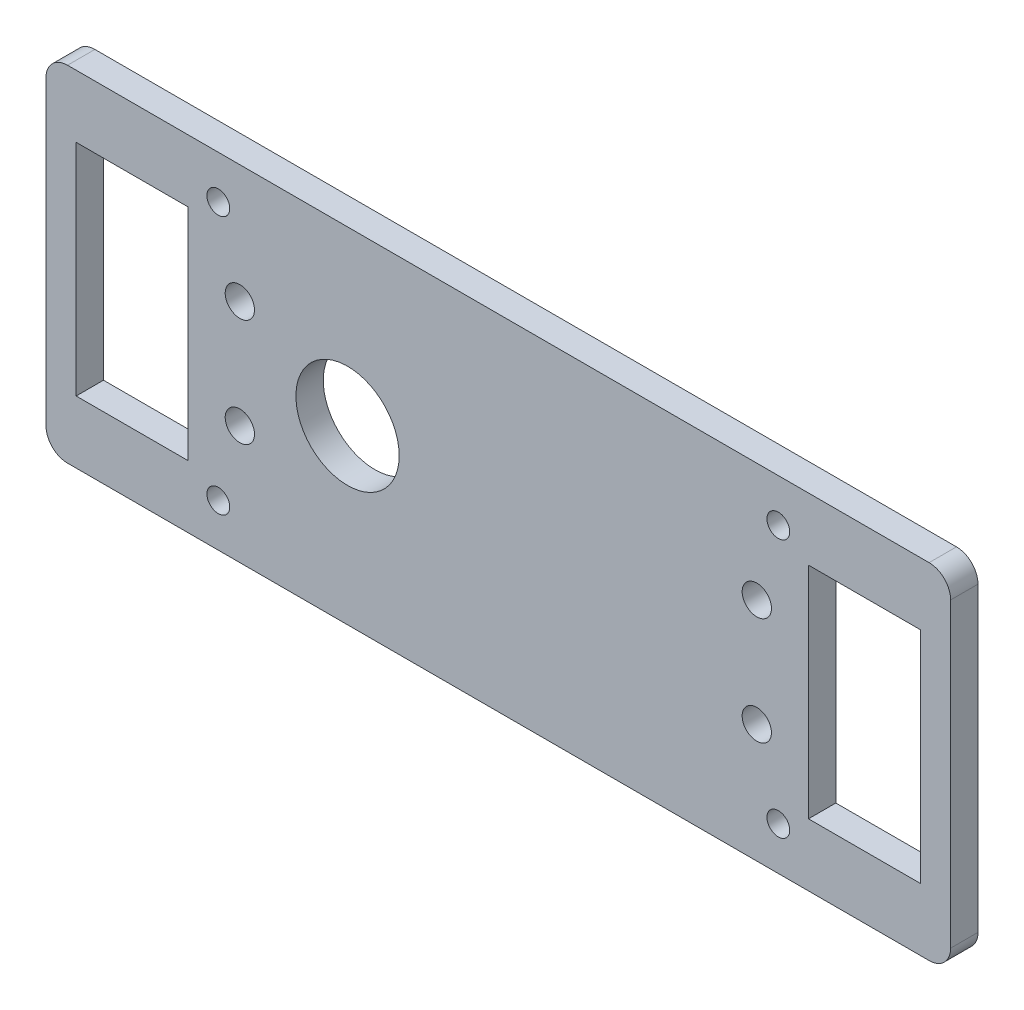
ISO-10303-21;
HEADER;
FILE_DESCRIPTION(('STEP AP214'),'2;1');
FILE_NAME('part.step','',(''),(''),'','','');
FILE_SCHEMA(('AUTOMOTIVE_DESIGN { 1 0 10303 214 1 1 1 1 }'));
ENDSEC;
DATA;
#1=APPLICATION_CONTEXT('core data for automotive mechanical design processes');
#2=APPLICATION_PROTOCOL_DEFINITION('international standard','automotive_design',2000,#1);
#3=PRODUCT_CONTEXT('',#1,'mechanical');
#4=PRODUCT('Part','Part','',(#3));
#5=PRODUCT_RELATED_PRODUCT_CATEGORY('part','',(#4));
#6=PRODUCT_DEFINITION_FORMATION('','',#4);
#7=PRODUCT_DEFINITION_CONTEXT('part definition',#1,'design');
#8=PRODUCT_DEFINITION('design','',#6,#7);
#9=PRODUCT_DEFINITION_SHAPE('','',#8);
#10=(LENGTH_UNIT() NAMED_UNIT(*) SI_UNIT(.MILLI.,.METRE.));
#11=(NAMED_UNIT(*) PLANE_ANGLE_UNIT() SI_UNIT($,.RADIAN.));
#12=(NAMED_UNIT(*) SI_UNIT($,.STERADIAN.) SOLID_ANGLE_UNIT());
#13=UNCERTAINTY_MEASURE_WITH_UNIT(LENGTH_MEASURE(1.E-05),#10,'distance_accuracy_value','');
#14=(GEOMETRIC_REPRESENTATION_CONTEXT(3) GLOBAL_UNCERTAINTY_ASSIGNED_CONTEXT((#13)) GLOBAL_UNIT_ASSIGNED_CONTEXT((#10,
#11,#12)) REPRESENTATION_CONTEXT('',''));
#15=CARTESIAN_POINT('',(0.,0.,0.));
#16=DIRECTION('',(0.,0.,1.));
#17=DIRECTION('',(1.,0.,0.));
#18=AXIS2_PLACEMENT_3D('',#15,#16,#17);
#19=CARTESIAN_POINT('',(-70.,40.,-6.35));
#20=DIRECTION('',(-1.,0.,0.));
#21=DIRECTION('',(0.,0.,1.));
#22=AXIS2_PLACEMENT_3D('',#19,#20,#21);
#23=PLANE('',#22);
#24=DIRECTION('',(0.,-1.,0.));
#25=VECTOR('',#24,1.);
#26=CARTESIAN_POINT('',(-70.,40.,-6.35));
#27=LINE('',#26,#25);
#28=CARTESIAN_POINT('',(-70.,35.,-6.35));
#29=VERTEX_POINT('',#28);
#30=CARTESIAN_POINT('',(-70.,-35.,-6.35));
#31=VERTEX_POINT('',#30);
#32=EDGE_CURVE('E266',#29,#31,#27,.T.);
#33=ORIENTED_EDGE('',*,*,#32,.T.);
#34=DIRECTION('',(0.,0.,1.));
#35=VECTOR('',#34,1.);
#36=CARTESIAN_POINT('',(-70.,-35.,-6.35));
#37=LINE('',#36,#35);
#38=CARTESIAN_POINT('',(-70.,-35.,0.));
#39=VERTEX_POINT('',#38);
#40=EDGE_CURVE('E11',#31,#39,#37,.T.);
#41=ORIENTED_EDGE('',*,*,#40,.T.);
#42=DIRECTION('',(0.,-1.,0.));
#43=VECTOR('',#42,1.);
#44=CARTESIAN_POINT('',(-70.,40.,0.));
#45=LINE('',#44,#43);
#46=CARTESIAN_POINT('',(-70.,35.,0.));
#47=VERTEX_POINT('',#46);
#48=EDGE_CURVE('E262',#47,#39,#45,.T.);
#49=ORIENTED_EDGE('',*,*,#48,.F.);
#50=DIRECTION('',(0.,0.,1.));
#51=VECTOR('',#50,1.);
#52=CARTESIAN_POINT('',(-70.,35.,-6.35));
#53=LINE('',#52,#51);
#54=EDGE_CURVE('E48',#47,#29,#53,.F.);
#55=ORIENTED_EDGE('',*,*,#54,.T.);
#56=EDGE_LOOP('',(#33,#41,#49,#55));
#57=FACE_BOUND('',#56,.T.);
#58=ADVANCED_FACE('F39',(#57),#23,.T.);
#59=CARTESIAN_POINT('',(-70.,40.,-6.35));
#60=DIRECTION('',(0.,1.,0.));
#61=DIRECTION('',(0.,0.,1.));
#62=AXIS2_PLACEMENT_3D('',#59,#60,#61);
#63=PLANE('',#62);
#64=DIRECTION('',(-1.,0.,0.));
#65=VECTOR('',#64,1.);
#66=CARTESIAN_POINT('',(-70.,40.,0.));
#67=LINE('',#66,#65);
#68=CARTESIAN_POINT('',(135.,40.,0.));
#69=VERTEX_POINT('',#68);
#70=CARTESIAN_POINT('',(-65.,40.,0.));
#71=VERTEX_POINT('',#70);
#72=EDGE_CURVE('E271',#69,#71,#67,.T.);
#73=ORIENTED_EDGE('',*,*,#72,.F.);
#74=DIRECTION('',(0.,0.,1.));
#75=VECTOR('',#74,1.);
#76=CARTESIAN_POINT('',(135.,40.,-6.35));
#77=LINE('',#76,#75);
#78=CARTESIAN_POINT('',(135.,40.,-6.35));
#79=VERTEX_POINT('',#78);
#80=EDGE_CURVE('E62',#69,#79,#77,.F.);
#81=ORIENTED_EDGE('',*,*,#80,.T.);
#82=DIRECTION('',(-1.,0.,0.));
#83=VECTOR('',#82,1.);
#84=CARTESIAN_POINT('',(-70.,40.,-6.35));
#85=LINE('',#84,#83);
#86=CARTESIAN_POINT('',(-65.,40.,-6.35));
#87=VERTEX_POINT('',#86);
#88=EDGE_CURVE('E279',#79,#87,#85,.T.);
#89=ORIENTED_EDGE('',*,*,#88,.T.);
#90=DIRECTION('',(0.,0.,1.));
#91=VECTOR('',#90,1.);
#92=CARTESIAN_POINT('',(-65.,40.,-6.35));
#93=LINE('',#92,#91);
#94=EDGE_CURVE('E333',#87,#71,#93,.T.);
#95=ORIENTED_EDGE('',*,*,#94,.T.);
#96=EDGE_LOOP('',(#73,#81,#89,#95));
#97=FACE_BOUND('',#96,.T.);
#98=ADVANCED_FACE('F348',(#97),#63,.T.);
#99=CARTESIAN_POINT('',(140.,40.,-6.35));
#100=DIRECTION('',(1.,0.,0.));
#101=DIRECTION('',(0.,0.,-1.));
#102=AXIS2_PLACEMENT_3D('',#99,#100,#101);
#103=PLANE('',#102);
#104=DIRECTION('',(0.,1.,0.));
#105=VECTOR('',#104,1.);
#106=CARTESIAN_POINT('',(140.,40.,0.));
#107=LINE('',#106,#105);
#108=CARTESIAN_POINT('',(140.,-35.,0.));
#109=VERTEX_POINT('',#108);
#110=CARTESIAN_POINT('',(140.,35.,0.));
#111=VERTEX_POINT('',#110);
#112=EDGE_CURVE('E290',#109,#111,#107,.T.);
#113=ORIENTED_EDGE('',*,*,#112,.F.);
#114=DIRECTION('',(0.,0.,1.));
#115=VECTOR('',#114,1.);
#116=CARTESIAN_POINT('',(140.,-35.,-6.35));
#117=LINE('',#116,#115);
#118=CARTESIAN_POINT('',(140.,-35.,-6.35));
#119=VERTEX_POINT('',#118);
#120=EDGE_CURVE('E319',#109,#119,#117,.F.);
#121=ORIENTED_EDGE('',*,*,#120,.T.);
#122=DIRECTION('',(0.,1.,0.));
#123=VECTOR('',#122,1.);
#124=CARTESIAN_POINT('',(140.,40.,-6.35));
#125=LINE('',#124,#123);
#126=CARTESIAN_POINT('',(140.,35.,-6.35));
#127=VERTEX_POINT('',#126);
#128=EDGE_CURVE('E275',#119,#127,#125,.T.);
#129=ORIENTED_EDGE('',*,*,#128,.T.);
#130=DIRECTION('',(0.,0.,1.));
#131=VECTOR('',#130,1.);
#132=CARTESIAN_POINT('',(140.,35.,-6.35));
#133=LINE('',#132,#131);
#134=EDGE_CURVE('E315',#127,#111,#133,.T.);
#135=ORIENTED_EDGE('',*,*,#134,.T.);
#136=EDGE_LOOP('',(#113,#121,#129,#135));
#137=FACE_BOUND('',#136,.T.);
#138=ADVANCED_FACE('F357',(#137),#103,.T.);
#139=CARTESIAN_POINT('',(-70.,-40.,-6.35));
#140=DIRECTION('',(0.,-1.,0.));
#141=DIRECTION('',(0.,0.,-1.));
#142=AXIS2_PLACEMENT_3D('',#139,#140,#141);
#143=PLANE('',#142);
#144=DIRECTION('',(1.,0.,0.));
#145=VECTOR('',#144,1.);
#146=CARTESIAN_POINT('',(-70.,-40.,-6.35));
#147=LINE('',#146,#145);
#148=CARTESIAN_POINT('',(-65.,-40.,-6.35));
#149=VERTEX_POINT('',#148);
#150=CARTESIAN_POINT('',(135.,-40.,-6.35));
#151=VERTEX_POINT('',#150);
#152=EDGE_CURVE('E270',#149,#151,#147,.T.);
#153=ORIENTED_EDGE('',*,*,#152,.T.);
#154=DIRECTION('',(0.,0.,1.));
#155=VECTOR('',#154,1.);
#156=CARTESIAN_POINT('',(135.,-40.,-6.35));
#157=LINE('',#156,#155);
#158=CARTESIAN_POINT('',(135.,-40.,0.));
#159=VERTEX_POINT('',#158);
#160=EDGE_CURVE('E299',#151,#159,#157,.T.);
#161=ORIENTED_EDGE('',*,*,#160,.T.);
#162=DIRECTION('',(1.,0.,0.));
#163=VECTOR('',#162,1.);
#164=CARTESIAN_POINT('',(-70.,-40.,0.));
#165=LINE('',#164,#163);
#166=CARTESIAN_POINT('',(-65.,-40.,0.));
#167=VERTEX_POINT('',#166);
#168=EDGE_CURVE('E286',#167,#159,#165,.T.);
#169=ORIENTED_EDGE('',*,*,#168,.F.);
#170=DIRECTION('',(0.,0.,1.));
#171=VECTOR('',#170,1.);
#172=CARTESIAN_POINT('',(-65.,-40.,-6.35));
#173=LINE('',#172,#171);
#174=EDGE_CURVE('E282',#167,#149,#173,.F.);
#175=ORIENTED_EDGE('',*,*,#174,.T.);
#176=EDGE_LOOP('',(#153,#161,#169,#175));
#177=FACE_BOUND('',#176,.T.);
#178=ADVANCED_FACE('F365',(#177),#143,.T.);
#179=CARTESIAN_POINT('',(0.,0.,-6.35));
#180=DIRECTION('',(0.,0.,1.));
#181=DIRECTION('',(1.,0.,0.));
#182=AXIS2_PLACEMENT_3D('',#179,#180,#181);
#183=PLANE('',#182);
#184=CARTESIAN_POINT('',(-25.,12.5,-6.35));
#185=DIRECTION('',(0.,0.,1.));
#186=DIRECTION('',(1.,0.,0.));
#187=AXIS2_PLACEMENT_3D('',#184,#185,#186);
#188=CIRCLE('',#187,3.4);
#189=CARTESIAN_POINT('',(-21.6,12.5,-6.35));
#190=VERTEX_POINT('',#189);
#191=EDGE_CURVE('E619',#190,#190,#188,.T.);
#192=ORIENTED_EDGE('',*,*,#191,.T.);
#193=EDGE_LOOP('',(#192));
#194=FACE_BOUND('',#193,.T.);
#195=CARTESIAN_POINT('',(-25.,-12.5,-6.35));
#196=DIRECTION('',(0.,0.,1.));
#197=DIRECTION('',(1.,0.,0.));
#198=AXIS2_PLACEMENT_3D('',#195,#196,#197);
#199=CIRCLE('',#198,3.4);
#200=CARTESIAN_POINT('',(-21.6,-12.5,-6.35));
#201=VERTEX_POINT('',#200);
#202=EDGE_CURVE('E632',#201,#201,#199,.T.);
#203=ORIENTED_EDGE('',*,*,#202,.T.);
#204=EDGE_LOOP('',(#203));
#205=FACE_BOUND('',#204,.T.);
#206=CARTESIAN_POINT('',(95.,12.5,-6.35));
#207=DIRECTION('',(0.,0.,1.));
#208=DIRECTION('',(1.,0.,0.));
#209=AXIS2_PLACEMENT_3D('',#206,#207,#208);
#210=CIRCLE('',#209,3.4);
#211=CARTESIAN_POINT('',(98.4,12.5,-6.35));
#212=VERTEX_POINT('',#211);
#213=EDGE_CURVE('E640',#212,#212,#210,.T.);
#214=ORIENTED_EDGE('',*,*,#213,.T.);
#215=EDGE_LOOP('',(#214));
#216=FACE_BOUND('',#215,.T.);
#217=CARTESIAN_POINT('',(95.,-12.5,-6.35));
#218=DIRECTION('',(0.,0.,1.));
#219=DIRECTION('',(1.,0.,0.));
#220=AXIS2_PLACEMENT_3D('',#217,#218,#219);
#221=CIRCLE('',#220,3.4);
#222=CARTESIAN_POINT('',(98.4,-12.5,-6.35));
#223=VERTEX_POINT('',#222);
#224=EDGE_CURVE('E648',#223,#223,#221,.T.);
#225=ORIENTED_EDGE('',*,*,#224,.T.);
#226=EDGE_LOOP('',(#225));
#227=FACE_BOUND('',#226,.T.);
#228=CARTESIAN_POINT('',(-30.,30.,-6.35));
#229=DIRECTION('',(0.,0.,1.));
#230=DIRECTION('',(1.,0.,0.));
#231=AXIS2_PLACEMENT_3D('',#228,#229,#230);
#232=CIRCLE('',#231,2.65);
#233=CARTESIAN_POINT('',(-27.35,30.,-6.35));
#234=VERTEX_POINT('',#233);
#235=EDGE_CURVE('E656',#234,#234,#232,.T.);
#236=ORIENTED_EDGE('',*,*,#235,.T.);
#237=EDGE_LOOP('',(#236));
#238=FACE_BOUND('',#237,.T.);
#239=CARTESIAN_POINT('',(-30.,-30.,-6.35));
#240=DIRECTION('',(0.,0.,1.));
#241=DIRECTION('',(1.,0.,0.));
#242=AXIS2_PLACEMENT_3D('',#239,#240,#241);
#243=CIRCLE('',#242,2.65);
#244=CARTESIAN_POINT('',(-27.35,-30.,-6.35));
#245=VERTEX_POINT('',#244);
#246=EDGE_CURVE('E664',#245,#245,#243,.T.);
#247=ORIENTED_EDGE('',*,*,#246,.T.);
#248=EDGE_LOOP('',(#247));
#249=FACE_BOUND('',#248,.T.);
#250=CARTESIAN_POINT('',(100.,-30.,-6.35));
#251=DIRECTION('',(0.,0.,1.));
#252=DIRECTION('',(1.,0.,0.));
#253=AXIS2_PLACEMENT_3D('',#250,#251,#252);
#254=CIRCLE('',#253,2.65);
#255=CARTESIAN_POINT('',(102.65,-30.,-6.35));
#256=VERTEX_POINT('',#255);
#257=EDGE_CURVE('E672',#256,#256,#254,.T.);
#258=ORIENTED_EDGE('',*,*,#257,.T.);
#259=EDGE_LOOP('',(#258));
#260=FACE_BOUND('',#259,.T.);
#261=CARTESIAN_POINT('',(100.,30.,-6.35));
#262=DIRECTION('',(0.,0.,1.));
#263=DIRECTION('',(1.,0.,0.));
#264=AXIS2_PLACEMENT_3D('',#261,#262,#263);
#265=CIRCLE('',#264,2.65);
#266=CARTESIAN_POINT('',(102.65,30.,-6.35));
#267=VERTEX_POINT('',#266);
#268=EDGE_CURVE('E190',#267,#267,#265,.T.);
#269=ORIENTED_EDGE('',*,*,#268,.T.);
#270=EDGE_LOOP('',(#269));
#271=FACE_BOUND('',#270,.T.);
#272=DIRECTION('',(-1.,0.,0.));
#273=VECTOR('',#272,1.);
#274=CARTESIAN_POINT('',(107.,25.5,-6.35));
#275=LINE('',#274,#273);
#276=CARTESIAN_POINT('',(133.,25.5,-6.35));
#277=VERTEX_POINT('',#276);
#278=CARTESIAN_POINT('',(107.,25.5,-6.35));
#279=VERTEX_POINT('',#278);
#280=EDGE_CURVE('E168',#277,#279,#275,.T.);
#281=ORIENTED_EDGE('',*,*,#280,.T.);
#282=DIRECTION('',(0.,-1.,0.));
#283=VECTOR('',#282,1.);
#284=CARTESIAN_POINT('',(107.,25.5,-6.35));
#285=LINE('',#284,#283);
#286=CARTESIAN_POINT('',(107.,-25.5,-6.35));
#287=VERTEX_POINT('',#286);
#288=EDGE_CURVE('E159',#279,#287,#285,.T.);
#289=ORIENTED_EDGE('',*,*,#288,.T.);
#290=DIRECTION('',(1.,0.,0.));
#291=VECTOR('',#290,1.);
#292=CARTESIAN_POINT('',(107.,-25.5,-6.35));
#293=LINE('',#292,#291);
#294=CARTESIAN_POINT('',(133.,-25.5,-6.35));
#295=VERTEX_POINT('',#294);
#296=EDGE_CURVE('E172',#287,#295,#293,.T.);
#297=ORIENTED_EDGE('',*,*,#296,.T.);
#298=DIRECTION('',(0.,1.,0.));
#299=VECTOR('',#298,1.);
#300=CARTESIAN_POINT('',(133.,25.5,-6.35));
#301=LINE('',#300,#299);
#302=EDGE_CURVE('E177',#295,#277,#301,.T.);
#303=ORIENTED_EDGE('',*,*,#302,.T.);
#304=EDGE_LOOP('',(#281,#289,#297,#303));
#305=FACE_BOUND('',#304,.T.);
#306=DIRECTION('',(-1.,0.,0.));
#307=VECTOR('',#306,1.);
#308=CARTESIAN_POINT('',(-63.,25.5,-6.35));
#309=LINE('',#308,#307);
#310=CARTESIAN_POINT('',(-37.,25.5,-6.35));
#311=VERTEX_POINT('',#310);
#312=CARTESIAN_POINT('',(-63.,25.5,-6.35));
#313=VERTEX_POINT('',#312);
#314=EDGE_CURVE('E227',#311,#313,#309,.T.);
#315=ORIENTED_EDGE('',*,*,#314,.T.);
#316=DIRECTION('',(0.,-1.,0.));
#317=VECTOR('',#316,1.);
#318=CARTESIAN_POINT('',(-63.,25.5,-6.35));
#319=LINE('',#318,#317);
#320=CARTESIAN_POINT('',(-63.,-25.5,-6.35));
#321=VERTEX_POINT('',#320);
#322=EDGE_CURVE('E214',#313,#321,#319,.T.);
#323=ORIENTED_EDGE('',*,*,#322,.T.);
#324=DIRECTION('',(1.,0.,0.));
#325=VECTOR('',#324,1.);
#326=CARTESIAN_POINT('',(-63.,-25.5,-6.35));
#327=LINE('',#326,#325);
#328=CARTESIAN_POINT('',(-37.,-25.5,-6.35));
#329=VERTEX_POINT('',#328);
#330=EDGE_CURVE('E218',#321,#329,#327,.T.);
#331=ORIENTED_EDGE('',*,*,#330,.T.);
#332=DIRECTION('',(0.,1.,0.));
#333=VECTOR('',#332,1.);
#334=CARTESIAN_POINT('',(-37.,25.5,-6.35));
#335=LINE('',#334,#333);
#336=EDGE_CURVE('E223',#329,#311,#335,.T.);
#337=ORIENTED_EDGE('',*,*,#336,.T.);
#338=EDGE_LOOP('',(#315,#323,#331,#337));
#339=FACE_BOUND('',#338,.T.);
#340=CARTESIAN_POINT('',(0.,0.,-6.35));
#341=DIRECTION('',(0.,0.,1.));
#342=DIRECTION('',(1.,0.,0.));
#343=AXIS2_PLACEMENT_3D('',#340,#341,#342);
#344=CIRCLE('',#343,11.9875);
#345=CARTESIAN_POINT('',(11.9875,0.,-6.35));
#346=VERTEX_POINT('',#345);
#347=EDGE_CURVE('E258',#346,#346,#344,.T.);
#348=ORIENTED_EDGE('',*,*,#347,.T.);
#349=EDGE_LOOP('',(#348));
#350=FACE_BOUND('',#349,.T.);
#351=ORIENTED_EDGE('',*,*,#128,.F.);
#352=CARTESIAN_POINT('',(135.,-35.,-6.35));
#353=DIRECTION('',(0.,0.,1.));
#354=DIRECTION('',(1.,0.,0.));
#355=AXIS2_PLACEMENT_3D('',#352,#353,#354);
#356=CIRCLE('',#355,5.);
#357=EDGE_CURVE('E330',#119,#151,#356,.F.);
#358=ORIENTED_EDGE('',*,*,#357,.T.);
#359=ORIENTED_EDGE('',*,*,#152,.F.);
#360=CARTESIAN_POINT('',(-65.,-35.,-6.35));
#361=DIRECTION('',(0.,0.,1.));
#362=DIRECTION('',(1.,0.,0.));
#363=AXIS2_PLACEMENT_3D('',#360,#361,#362);
#364=CIRCLE('',#363,5.);
#365=EDGE_CURVE('E324',#149,#31,#364,.F.);
#366=ORIENTED_EDGE('',*,*,#365,.T.);
#367=ORIENTED_EDGE('',*,*,#32,.F.);
#368=CARTESIAN_POINT('',(-65.,35.,-6.35));
#369=DIRECTION('',(0.,0.,1.));
#370=DIRECTION('',(1.,0.,0.));
#371=AXIS2_PLACEMENT_3D('',#368,#369,#370);
#372=CIRCLE('',#371,5.);
#373=EDGE_CURVE('E55',#29,#87,#372,.F.);
#374=ORIENTED_EDGE('',*,*,#373,.T.);
#375=ORIENTED_EDGE('',*,*,#88,.F.);
#376=CARTESIAN_POINT('',(135.,35.,-6.35));
#377=DIRECTION('',(0.,0.,1.));
#378=DIRECTION('',(1.,0.,0.));
#379=AXIS2_PLACEMENT_3D('',#376,#377,#378);
#380=CIRCLE('',#379,5.);
#381=EDGE_CURVE('E327',#79,#127,#380,.F.);
#382=ORIENTED_EDGE('',*,*,#381,.T.);
#383=EDGE_LOOP('',(#351,#358,#359,#366,#367,#374,#375,#382));
#384=FACE_BOUND('',#383,.T.);
#385=ADVANCED_FACE('F179',(#194,#205,#216,#227,#238,#249,#260,#271,#305,#339,#350,#384),#183,.F.);
#386=CARTESIAN_POINT('',(0.,0.,0.));
#387=DIRECTION('',(0.,0.,1.));
#388=DIRECTION('',(1.,0.,0.));
#389=AXIS2_PLACEMENT_3D('',#386,#387,#388);
#390=PLANE('',#389);
#391=CARTESIAN_POINT('',(-25.,12.5,0.));
#392=DIRECTION('',(0.,0.,1.));
#393=DIRECTION('',(1.,0.,0.));
#394=AXIS2_PLACEMENT_3D('',#391,#392,#393);
#395=CIRCLE('',#394,3.4);
#396=CARTESIAN_POINT('',(-21.6,12.5,0.));
#397=VERTEX_POINT('',#396);
#398=EDGE_CURVE('E622',#397,#397,#395,.T.);
#399=ORIENTED_EDGE('',*,*,#398,.F.);
#400=EDGE_LOOP('',(#399));
#401=FACE_BOUND('',#400,.T.);
#402=CARTESIAN_POINT('',(-25.,-12.5,0.));
#403=DIRECTION('',(0.,0.,1.));
#404=DIRECTION('',(1.,0.,0.));
#405=AXIS2_PLACEMENT_3D('',#402,#403,#404);
#406=CIRCLE('',#405,3.4);
#407=CARTESIAN_POINT('',(-21.6,-12.5,0.));
#408=VERTEX_POINT('',#407);
#409=EDGE_CURVE('E626',#408,#408,#406,.T.);
#410=ORIENTED_EDGE('',*,*,#409,.F.);
#411=EDGE_LOOP('',(#410));
#412=FACE_BOUND('',#411,.T.);
#413=CARTESIAN_POINT('',(95.,12.5,0.));
#414=DIRECTION('',(0.,0.,1.));
#415=DIRECTION('',(1.,0.,0.));
#416=AXIS2_PLACEMENT_3D('',#413,#414,#415);
#417=CIRCLE('',#416,3.4);
#418=CARTESIAN_POINT('',(98.4,12.5,0.));
#419=VERTEX_POINT('',#418);
#420=EDGE_CURVE('E636',#419,#419,#417,.T.);
#421=ORIENTED_EDGE('',*,*,#420,.F.);
#422=EDGE_LOOP('',(#421));
#423=FACE_BOUND('',#422,.T.);
#424=CARTESIAN_POINT('',(95.,-12.5,0.));
#425=DIRECTION('',(0.,0.,1.));
#426=DIRECTION('',(1.,0.,0.));
#427=AXIS2_PLACEMENT_3D('',#424,#425,#426);
#428=CIRCLE('',#427,3.4);
#429=CARTESIAN_POINT('',(98.4,-12.5,0.));
#430=VERTEX_POINT('',#429);
#431=EDGE_CURVE('E644',#430,#430,#428,.T.);
#432=ORIENTED_EDGE('',*,*,#431,.F.);
#433=EDGE_LOOP('',(#432));
#434=FACE_BOUND('',#433,.T.);
#435=CARTESIAN_POINT('',(-30.,30.,0.));
#436=DIRECTION('',(0.,0.,1.));
#437=DIRECTION('',(1.,0.,0.));
#438=AXIS2_PLACEMENT_3D('',#435,#436,#437);
#439=CIRCLE('',#438,2.65);
#440=CARTESIAN_POINT('',(-27.35,30.,0.));
#441=VERTEX_POINT('',#440);
#442=EDGE_CURVE('E652',#441,#441,#439,.T.);
#443=ORIENTED_EDGE('',*,*,#442,.F.);
#444=EDGE_LOOP('',(#443));
#445=FACE_BOUND('',#444,.T.);
#446=CARTESIAN_POINT('',(-30.,-30.,0.));
#447=DIRECTION('',(0.,0.,1.));
#448=DIRECTION('',(1.,0.,0.));
#449=AXIS2_PLACEMENT_3D('',#446,#447,#448);
#450=CIRCLE('',#449,2.65);
#451=CARTESIAN_POINT('',(-27.35,-30.,0.));
#452=VERTEX_POINT('',#451);
#453=EDGE_CURVE('E660',#452,#452,#450,.T.);
#454=ORIENTED_EDGE('',*,*,#453,.F.);
#455=EDGE_LOOP('',(#454));
#456=FACE_BOUND('',#455,.T.);
#457=CARTESIAN_POINT('',(100.,-30.,0.));
#458=DIRECTION('',(0.,0.,1.));
#459=DIRECTION('',(1.,0.,0.));
#460=AXIS2_PLACEMENT_3D('',#457,#458,#459);
#461=CIRCLE('',#460,2.65);
#462=CARTESIAN_POINT('',(102.65,-30.,0.));
#463=VERTEX_POINT('',#462);
#464=EDGE_CURVE('E668',#463,#463,#461,.T.);
#465=ORIENTED_EDGE('',*,*,#464,.F.);
#466=EDGE_LOOP('',(#465));
#467=FACE_BOUND('',#466,.T.);
#468=CARTESIAN_POINT('',(100.,30.,0.));
#469=DIRECTION('',(0.,0.,1.));
#470=DIRECTION('',(1.,0.,0.));
#471=AXIS2_PLACEMENT_3D('',#468,#469,#470);
#472=CIRCLE('',#471,2.65);
#473=CARTESIAN_POINT('',(102.65,30.,0.));
#474=VERTEX_POINT('',#473);
#475=EDGE_CURVE('E675',#474,#474,#472,.T.);
#476=ORIENTED_EDGE('',*,*,#475,.F.);
#477=EDGE_LOOP('',(#476));
#478=FACE_BOUND('',#477,.T.);
#479=DIRECTION('',(0.,-1.,0.));
#480=VECTOR('',#479,1.);
#481=CARTESIAN_POINT('',(107.,25.5,0.));
#482=LINE('',#481,#480);
#483=CARTESIAN_POINT('',(107.,25.5,0.));
#484=VERTEX_POINT('',#483);
#485=CARTESIAN_POINT('',(107.,-25.5,0.));
#486=VERTEX_POINT('',#485);
#487=EDGE_CURVE('E162',#484,#486,#482,.T.);
#488=ORIENTED_EDGE('',*,*,#487,.F.);
#489=DIRECTION('',(-1.,0.,0.));
#490=VECTOR('',#489,1.);
#491=CARTESIAN_POINT('',(107.,25.5,0.));
#492=LINE('',#491,#490);
#493=CARTESIAN_POINT('',(133.,25.5,0.));
#494=VERTEX_POINT('',#493);
#495=EDGE_CURVE('E183',#494,#484,#492,.T.);
#496=ORIENTED_EDGE('',*,*,#495,.F.);
#497=DIRECTION('',(0.,1.,0.));
#498=VECTOR('',#497,1.);
#499=CARTESIAN_POINT('',(133.,25.5,0.));
#500=LINE('',#499,#498);
#501=CARTESIAN_POINT('',(133.,-25.5,0.));
#502=VERTEX_POINT('',#501);
#503=EDGE_CURVE('E187',#502,#494,#500,.T.);
#504=ORIENTED_EDGE('',*,*,#503,.F.);
#505=DIRECTION('',(1.,0.,0.));
#506=VECTOR('',#505,1.);
#507=CARTESIAN_POINT('',(107.,-25.5,0.));
#508=LINE('',#507,#506);
#509=EDGE_CURVE('E199',#486,#502,#508,.T.);
#510=ORIENTED_EDGE('',*,*,#509,.F.);
#511=EDGE_LOOP('',(#488,#496,#504,#510));
#512=FACE_BOUND('',#511,.T.);
#513=DIRECTION('',(0.,-1.,0.));
#514=VECTOR('',#513,1.);
#515=CARTESIAN_POINT('',(-63.,25.5,0.));
#516=LINE('',#515,#514);
#517=CARTESIAN_POINT('',(-63.,25.5,0.));
#518=VERTEX_POINT('',#517);
#519=CARTESIAN_POINT('',(-63.,-25.5,0.));
#520=VERTEX_POINT('',#519);
#521=EDGE_CURVE('E208',#518,#520,#516,.T.);
#522=ORIENTED_EDGE('',*,*,#521,.F.);
#523=DIRECTION('',(-1.,0.,0.));
#524=VECTOR('',#523,1.);
#525=CARTESIAN_POINT('',(-63.,25.5,0.));
#526=LINE('',#525,#524);
#527=CARTESIAN_POINT('',(-37.,25.5,0.));
#528=VERTEX_POINT('',#527);
#529=EDGE_CURVE('E219',#528,#518,#526,.T.);
#530=ORIENTED_EDGE('',*,*,#529,.F.);
#531=DIRECTION('',(0.,1.,0.));
#532=VECTOR('',#531,1.);
#533=CARTESIAN_POINT('',(-37.,25.5,0.));
#534=LINE('',#533,#532);
#535=CARTESIAN_POINT('',(-37.,-25.5,0.));
#536=VERTEX_POINT('',#535);
#537=EDGE_CURVE('E238',#536,#528,#534,.T.);
#538=ORIENTED_EDGE('',*,*,#537,.F.);
#539=DIRECTION('',(1.,0.,0.));
#540=VECTOR('',#539,1.);
#541=CARTESIAN_POINT('',(-63.,-25.5,0.));
#542=LINE('',#541,#540);
#543=EDGE_CURVE('E234',#520,#536,#542,.T.);
#544=ORIENTED_EDGE('',*,*,#543,.F.);
#545=EDGE_LOOP('',(#522,#530,#538,#544));
#546=FACE_BOUND('',#545,.T.);
#547=CARTESIAN_POINT('',(0.,0.,0.));
#548=DIRECTION('',(0.,0.,1.));
#549=DIRECTION('',(1.,0.,0.));
#550=AXIS2_PLACEMENT_3D('',#547,#548,#549);
#551=CIRCLE('',#550,11.9875);
#552=CARTESIAN_POINT('',(11.9875,0.,0.));
#553=VERTEX_POINT('',#552);
#554=EDGE_CURVE('E248',#553,#553,#551,.T.);
#555=ORIENTED_EDGE('',*,*,#554,.F.);
#556=EDGE_LOOP('',(#555));
#557=FACE_BOUND('',#556,.T.);
#558=ORIENTED_EDGE('',*,*,#168,.T.);
#559=CARTESIAN_POINT('',(135.,-35.,0.));
#560=DIRECTION('',(0.,0.,1.));
#561=DIRECTION('',(1.,0.,0.));
#562=AXIS2_PLACEMENT_3D('',#559,#560,#561);
#563=CIRCLE('',#562,5.);
#564=EDGE_CURVE('E312',#159,#109,#563,.T.);
#565=ORIENTED_EDGE('',*,*,#564,.T.);
#566=ORIENTED_EDGE('',*,*,#112,.T.);
#567=CARTESIAN_POINT('',(135.,35.,0.));
#568=DIRECTION('',(0.,0.,1.));
#569=DIRECTION('',(1.,0.,0.));
#570=AXIS2_PLACEMENT_3D('',#567,#568,#569);
#571=CIRCLE('',#570,5.);
#572=EDGE_CURVE('E309',#111,#69,#571,.T.);
#573=ORIENTED_EDGE('',*,*,#572,.T.);
#574=ORIENTED_EDGE('',*,*,#72,.T.);
#575=CARTESIAN_POINT('',(-65.,35.,0.));
#576=DIRECTION('',(0.,0.,1.));
#577=DIRECTION('',(1.,0.,0.));
#578=AXIS2_PLACEMENT_3D('',#575,#576,#577);
#579=CIRCLE('',#578,5.);
#580=EDGE_CURVE('E303',#71,#47,#579,.T.);
#581=ORIENTED_EDGE('',*,*,#580,.T.);
#582=ORIENTED_EDGE('',*,*,#48,.T.);
#583=CARTESIAN_POINT('',(-65.,-35.,0.));
#584=DIRECTION('',(0.,0.,1.));
#585=DIRECTION('',(1.,0.,0.));
#586=AXIS2_PLACEMENT_3D('',#583,#584,#585);
#587=CIRCLE('',#586,5.);
#588=EDGE_CURVE('E306',#39,#167,#587,.T.);
#589=ORIENTED_EDGE('',*,*,#588,.T.);
#590=EDGE_LOOP('',(#558,#565,#566,#573,#574,#581,#582,#589));
#591=FACE_BOUND('',#590,.T.);
#592=ADVANCED_FACE('F350',(#401,#412,#423,#434,#445,#456,#467,#478,#512,#546,#557,#591),#390,.T.);
#593=CARTESIAN_POINT('',(0.,0.,-6.35));
#594=DIRECTION('',(0.,0.,1.));
#595=DIRECTION('',(1.,0.,0.));
#596=AXIS2_PLACEMENT_3D('',#593,#594,#595);
#597=CYLINDRICAL_SURFACE('',#596,11.9875);
#598=ORIENTED_EDGE('',*,*,#347,.F.);
#599=EDGE_LOOP('',(#598));
#600=FACE_BOUND('',#599,.T.);
#601=ORIENTED_EDGE('',*,*,#554,.T.);
#602=EDGE_LOOP('',(#601));
#603=FACE_BOUND('',#602,.T.);
#604=ADVANCED_FACE('F438',(#600,#603),#597,.F.);
#605=CARTESIAN_POINT('',(-63.,25.5,-6.35));
#606=DIRECTION('',(-1.,0.,0.));
#607=DIRECTION('',(0.,0.,1.));
#608=AXIS2_PLACEMENT_3D('',#605,#606,#607);
#609=PLANE('',#608);
#610=ORIENTED_EDGE('',*,*,#521,.T.);
#611=DIRECTION('',(0.,0.,1.));
#612=VECTOR('',#611,1.);
#613=CARTESIAN_POINT('',(-63.,-25.5,-6.35));
#614=LINE('',#613,#612);
#615=EDGE_CURVE('E231',#321,#520,#614,.T.);
#616=ORIENTED_EDGE('',*,*,#615,.F.);
#617=ORIENTED_EDGE('',*,*,#322,.F.);
#618=DIRECTION('',(0.,0.,1.));
#619=VECTOR('',#618,1.);
#620=CARTESIAN_POINT('',(-63.,25.5,-6.35));
#621=LINE('',#620,#619);
#622=EDGE_CURVE('E245',#313,#518,#621,.T.);
#623=ORIENTED_EDGE('',*,*,#622,.T.);
#624=EDGE_LOOP('',(#610,#616,#617,#623));
#625=FACE_BOUND('',#624,.T.);
#626=ADVANCED_FACE('F428',(#625),#609,.F.);
#627=CARTESIAN_POINT('',(-63.,25.5,-6.35));
#628=DIRECTION('',(0.,1.,0.));
#629=DIRECTION('',(0.,0.,1.));
#630=AXIS2_PLACEMENT_3D('',#627,#628,#629);
#631=PLANE('',#630);
#632=ORIENTED_EDGE('',*,*,#529,.T.);
#633=ORIENTED_EDGE('',*,*,#622,.F.);
#634=ORIENTED_EDGE('',*,*,#314,.F.);
#635=DIRECTION('',(0.,0.,1.));
#636=VECTOR('',#635,1.);
#637=CARTESIAN_POINT('',(-37.,25.5,-6.35));
#638=LINE('',#637,#636);
#639=EDGE_CURVE('E249',#311,#528,#638,.T.);
#640=ORIENTED_EDGE('',*,*,#639,.T.);
#641=EDGE_LOOP('',(#632,#633,#634,#640));
#642=FACE_BOUND('',#641,.T.);
#643=ADVANCED_FACE('F424',(#642),#631,.F.);
#644=CARTESIAN_POINT('',(-37.,25.5,-6.35));
#645=DIRECTION('',(1.,0.,0.));
#646=DIRECTION('',(0.,0.,-1.));
#647=AXIS2_PLACEMENT_3D('',#644,#645,#646);
#648=PLANE('',#647);
#649=ORIENTED_EDGE('',*,*,#537,.T.);
#650=ORIENTED_EDGE('',*,*,#639,.F.);
#651=ORIENTED_EDGE('',*,*,#336,.F.);
#652=DIRECTION('',(0.,0.,1.));
#653=VECTOR('',#652,1.);
#654=CARTESIAN_POINT('',(-37.,-25.5,-6.35));
#655=LINE('',#654,#653);
#656=EDGE_CURVE('E252',#329,#536,#655,.T.);
#657=ORIENTED_EDGE('',*,*,#656,.T.);
#658=EDGE_LOOP('',(#649,#650,#651,#657));
#659=FACE_BOUND('',#658,.T.);
#660=ADVANCED_FACE('F427',(#659),#648,.F.);
#661=CARTESIAN_POINT('',(-63.,-25.5,-6.35));
#662=DIRECTION('',(0.,-1.,0.));
#663=DIRECTION('',(0.,0.,-1.));
#664=AXIS2_PLACEMENT_3D('',#661,#662,#663);
#665=PLANE('',#664);
#666=ORIENTED_EDGE('',*,*,#543,.T.);
#667=ORIENTED_EDGE('',*,*,#656,.F.);
#668=ORIENTED_EDGE('',*,*,#330,.F.);
#669=ORIENTED_EDGE('',*,*,#615,.T.);
#670=EDGE_LOOP('',(#666,#667,#668,#669));
#671=FACE_BOUND('',#670,.T.);
#672=ADVANCED_FACE('F423',(#671),#665,.F.);
#673=CARTESIAN_POINT('',(107.,25.5,-6.35));
#674=DIRECTION('',(-1.,0.,0.));
#675=DIRECTION('',(0.,0.,1.));
#676=AXIS2_PLACEMENT_3D('',#673,#674,#675);
#677=PLANE('',#676);
#678=ORIENTED_EDGE('',*,*,#487,.T.);
#679=DIRECTION('',(0.,0.,1.));
#680=VECTOR('',#679,1.);
#681=CARTESIAN_POINT('',(107.,-25.5,-6.35));
#682=LINE('',#681,#680);
#683=EDGE_CURVE('E155',#287,#486,#682,.T.);
#684=ORIENTED_EDGE('',*,*,#683,.F.);
#685=ORIENTED_EDGE('',*,*,#288,.F.);
#686=DIRECTION('',(0.,0.,1.));
#687=VECTOR('',#686,1.);
#688=CARTESIAN_POINT('',(107.,25.5,-6.35));
#689=LINE('',#688,#687);
#690=EDGE_CURVE('E205',#279,#484,#689,.T.);
#691=ORIENTED_EDGE('',*,*,#690,.T.);
#692=EDGE_LOOP('',(#678,#684,#685,#691));
#693=FACE_BOUND('',#692,.T.);
#694=ADVANCED_FACE('F157',(#693),#677,.F.);
#695=CARTESIAN_POINT('',(107.,25.5,-6.35));
#696=DIRECTION('',(0.,1.,0.));
#697=DIRECTION('',(-1.,0.,0.));
#698=AXIS2_PLACEMENT_3D('',#695,#696,#697);
#699=PLANE('',#698);
#700=ORIENTED_EDGE('',*,*,#495,.T.);
#701=ORIENTED_EDGE('',*,*,#690,.F.);
#702=ORIENTED_EDGE('',*,*,#280,.F.);
#703=DIRECTION('',(0.,0.,1.));
#704=VECTOR('',#703,1.);
#705=CARTESIAN_POINT('',(133.,25.5,-6.35));
#706=LINE('',#705,#704);
#707=EDGE_CURVE('E209',#277,#494,#706,.T.);
#708=ORIENTED_EDGE('',*,*,#707,.T.);
#709=EDGE_LOOP('',(#700,#701,#702,#708));
#710=FACE_BOUND('',#709,.T.);
#711=ADVANCED_FACE('F411',(#710),#699,.F.);
#712=CARTESIAN_POINT('',(133.,25.5,-6.35));
#713=DIRECTION('',(1.,0.,0.));
#714=DIRECTION('',(0.,0.,-1.));
#715=AXIS2_PLACEMENT_3D('',#712,#713,#714);
#716=PLANE('',#715);
#717=ORIENTED_EDGE('',*,*,#503,.T.);
#718=ORIENTED_EDGE('',*,*,#707,.F.);
#719=ORIENTED_EDGE('',*,*,#302,.F.);
#720=DIRECTION('',(0.,0.,1.));
#721=VECTOR('',#720,1.);
#722=CARTESIAN_POINT('',(133.,-25.5,-6.35));
#723=LINE('',#722,#721);
#724=EDGE_CURVE('E167',#295,#502,#723,.T.);
#725=ORIENTED_EDGE('',*,*,#724,.T.);
#726=EDGE_LOOP('',(#717,#718,#719,#725));
#727=FACE_BOUND('',#726,.T.);
#728=ADVANCED_FACE('F414',(#727),#716,.F.);
#729=CARTESIAN_POINT('',(107.,-25.5,-6.35));
#730=DIRECTION('',(0.,-1.,0.));
#731=DIRECTION('',(1.,0.,0.));
#732=AXIS2_PLACEMENT_3D('',#729,#730,#731);
#733=PLANE('',#732);
#734=ORIENTED_EDGE('',*,*,#509,.T.);
#735=ORIENTED_EDGE('',*,*,#724,.F.);
#736=ORIENTED_EDGE('',*,*,#296,.F.);
#737=ORIENTED_EDGE('',*,*,#683,.T.);
#738=EDGE_LOOP('',(#734,#735,#736,#737));
#739=FACE_BOUND('',#738,.T.);
#740=ADVANCED_FACE('F173',(#739),#733,.F.);
#741=CARTESIAN_POINT('',(100.,30.,0.));
#742=DIRECTION('',(0.,0.,1.));
#743=DIRECTION('',(1.,0.,0.));
#744=AXIS2_PLACEMENT_3D('',#741,#742,#743);
#745=CYLINDRICAL_SURFACE('',#744,2.65);
#746=ORIENTED_EDGE('',*,*,#268,.F.);
#747=EDGE_LOOP('',(#746));
#748=FACE_BOUND('',#747,.T.);
#749=ORIENTED_EDGE('',*,*,#475,.T.);
#750=EDGE_LOOP('',(#749));
#751=FACE_BOUND('',#750,.T.);
#752=ADVANCED_FACE('F406',(#748,#751),#745,.F.);
#753=CARTESIAN_POINT('',(100.,-30.,0.));
#754=DIRECTION('',(0.,0.,1.));
#755=DIRECTION('',(1.,0.,0.));
#756=AXIS2_PLACEMENT_3D('',#753,#754,#755);
#757=CYLINDRICAL_SURFACE('',#756,2.65);
#758=ORIENTED_EDGE('',*,*,#257,.F.);
#759=EDGE_LOOP('',(#758));
#760=FACE_BOUND('',#759,.T.);
#761=ORIENTED_EDGE('',*,*,#464,.T.);
#762=EDGE_LOOP('',(#761));
#763=FACE_BOUND('',#762,.T.);
#764=ADVANCED_FACE('F396',(#760,#763),#757,.F.);
#765=CARTESIAN_POINT('',(-30.,-30.,0.));
#766=DIRECTION('',(0.,0.,1.));
#767=DIRECTION('',(1.,0.,0.));
#768=AXIS2_PLACEMENT_3D('',#765,#766,#767);
#769=CYLINDRICAL_SURFACE('',#768,2.65);
#770=ORIENTED_EDGE('',*,*,#246,.F.);
#771=EDGE_LOOP('',(#770));
#772=FACE_BOUND('',#771,.T.);
#773=ORIENTED_EDGE('',*,*,#453,.T.);
#774=EDGE_LOOP('',(#773));
#775=FACE_BOUND('',#774,.T.);
#776=ADVANCED_FACE('F390',(#772,#775),#769,.F.);
#777=CARTESIAN_POINT('',(-30.,30.,0.));
#778=DIRECTION('',(0.,0.,1.));
#779=DIRECTION('',(1.,0.,0.));
#780=AXIS2_PLACEMENT_3D('',#777,#778,#779);
#781=CYLINDRICAL_SURFACE('',#780,2.65);
#782=ORIENTED_EDGE('',*,*,#235,.F.);
#783=EDGE_LOOP('',(#782));
#784=FACE_BOUND('',#783,.T.);
#785=ORIENTED_EDGE('',*,*,#442,.T.);
#786=EDGE_LOOP('',(#785));
#787=FACE_BOUND('',#786,.T.);
#788=ADVANCED_FACE('F386',(#784,#787),#781,.F.);
#789=CARTESIAN_POINT('',(135.,-35.,-6.35));
#790=DIRECTION('',(0.,0.,1.));
#791=DIRECTION('',(1.,0.,0.));
#792=AXIS2_PLACEMENT_3D('',#789,#790,#791);
#793=CYLINDRICAL_SURFACE('',#792,5.);
#794=ORIENTED_EDGE('',*,*,#357,.F.);
#795=ORIENTED_EDGE('',*,*,#120,.F.);
#796=ORIENTED_EDGE('',*,*,#564,.F.);
#797=ORIENTED_EDGE('',*,*,#160,.F.);
#798=EDGE_LOOP('',(#794,#795,#796,#797));
#799=FACE_BOUND('',#798,.T.);
#800=ADVANCED_FACE('F362',(#799),#793,.T.);
#801=CARTESIAN_POINT('',(135.,35.,-6.35));
#802=DIRECTION('',(0.,0.,1.));
#803=DIRECTION('',(1.,0.,0.));
#804=AXIS2_PLACEMENT_3D('',#801,#802,#803);
#805=CYLINDRICAL_SURFACE('',#804,5.);
#806=ORIENTED_EDGE('',*,*,#381,.F.);
#807=ORIENTED_EDGE('',*,*,#80,.F.);
#808=ORIENTED_EDGE('',*,*,#572,.F.);
#809=ORIENTED_EDGE('',*,*,#134,.F.);
#810=EDGE_LOOP('',(#806,#807,#808,#809));
#811=FACE_BOUND('',#810,.T.);
#812=ADVANCED_FACE('F355',(#811),#805,.T.);
#813=CARTESIAN_POINT('',(-65.,-35.,-6.35));
#814=DIRECTION('',(0.,0.,1.));
#815=DIRECTION('',(1.,0.,0.));
#816=AXIS2_PLACEMENT_3D('',#813,#814,#815);
#817=CYLINDRICAL_SURFACE('',#816,5.);
#818=ORIENTED_EDGE('',*,*,#365,.F.);
#819=ORIENTED_EDGE('',*,*,#174,.F.);
#820=ORIENTED_EDGE('',*,*,#588,.F.);
#821=ORIENTED_EDGE('',*,*,#40,.F.);
#822=EDGE_LOOP('',(#818,#819,#820,#821));
#823=FACE_BOUND('',#822,.T.);
#824=ADVANCED_FACE('F368',(#823),#817,.T.);
#825=CARTESIAN_POINT('',(-65.,35.,-6.35));
#826=DIRECTION('',(0.,0.,1.));
#827=DIRECTION('',(1.,0.,0.));
#828=AXIS2_PLACEMENT_3D('',#825,#826,#827);
#829=CYLINDRICAL_SURFACE('',#828,5.);
#830=ORIENTED_EDGE('',*,*,#373,.F.);
#831=ORIENTED_EDGE('',*,*,#54,.F.);
#832=ORIENTED_EDGE('',*,*,#580,.F.);
#833=ORIENTED_EDGE('',*,*,#94,.F.);
#834=EDGE_LOOP('',(#830,#831,#832,#833));
#835=FACE_BOUND('',#834,.T.);
#836=ADVANCED_FACE('F41',(#835),#829,.T.);
#837=CARTESIAN_POINT('',(95.,-12.5,0.));
#838=DIRECTION('',(0.,0.,1.));
#839=DIRECTION('',(1.,0.,0.));
#840=AXIS2_PLACEMENT_3D('',#837,#838,#839);
#841=CYLINDRICAL_SURFACE('',#840,3.4);
#842=ORIENTED_EDGE('',*,*,#224,.F.);
#843=EDGE_LOOP('',(#842));
#844=FACE_BOUND('',#843,.T.);
#845=ORIENTED_EDGE('',*,*,#431,.T.);
#846=EDGE_LOOP('',(#845));
#847=FACE_BOUND('',#846,.T.);
#848=ADVANCED_FACE('F374',(#844,#847),#841,.F.);
#849=CARTESIAN_POINT('',(95.,12.5,0.));
#850=DIRECTION('',(0.,0.,1.));
#851=DIRECTION('',(1.,0.,0.));
#852=AXIS2_PLACEMENT_3D('',#849,#850,#851);
#853=CYLINDRICAL_SURFACE('',#852,3.4);
#854=ORIENTED_EDGE('',*,*,#213,.F.);
#855=EDGE_LOOP('',(#854));
#856=FACE_BOUND('',#855,.T.);
#857=ORIENTED_EDGE('',*,*,#420,.T.);
#858=EDGE_LOOP('',(#857));
#859=FACE_BOUND('',#858,.T.);
#860=ADVANCED_FACE('F584',(#856,#859),#853,.F.);
#861=CARTESIAN_POINT('',(-25.,-12.5,0.));
#862=DIRECTION('',(0.,0.,1.));
#863=DIRECTION('',(1.,0.,0.));
#864=AXIS2_PLACEMENT_3D('',#861,#862,#863);
#865=CYLINDRICAL_SURFACE('',#864,3.4);
#866=ORIENTED_EDGE('',*,*,#202,.F.);
#867=EDGE_LOOP('',(#866));
#868=FACE_BOUND('',#867,.T.);
#869=ORIENTED_EDGE('',*,*,#409,.T.);
#870=EDGE_LOOP('',(#869));
#871=FACE_BOUND('',#870,.T.);
#872=ADVANCED_FACE('F592',(#868,#871),#865,.F.);
#873=CARTESIAN_POINT('',(-25.,12.5,0.));
#874=DIRECTION('',(0.,0.,1.));
#875=DIRECTION('',(1.,0.,0.));
#876=AXIS2_PLACEMENT_3D('',#873,#874,#875);
#877=CYLINDRICAL_SURFACE('',#876,3.4);
#878=ORIENTED_EDGE('',*,*,#191,.F.);
#879=EDGE_LOOP('',(#878));
#880=FACE_BOUND('',#879,.T.);
#881=ORIENTED_EDGE('',*,*,#398,.T.);
#882=EDGE_LOOP('',(#881));
#883=FACE_BOUND('',#882,.T.);
#884=ADVANCED_FACE('F600',(#880,#883),#877,.F.);
#885=CLOSED_SHELL('',(#58,#98,#138,#178,#385,#592,#604,#626,#643,#660,#672,#694,#711,#728,#740,
#752,#764,#776,#788,#800,#812,#824,#836,#848,#860,#872,#884));
#886=MANIFOLD_SOLID_BREP('B2',#885);
#887=ADVANCED_BREP_SHAPE_REPRESENTATION('',(#18,#886),#14);
#888=SHAPE_DEFINITION_REPRESENTATION(#9,#887);
ENDSEC;
END-ISO-10303-21;
